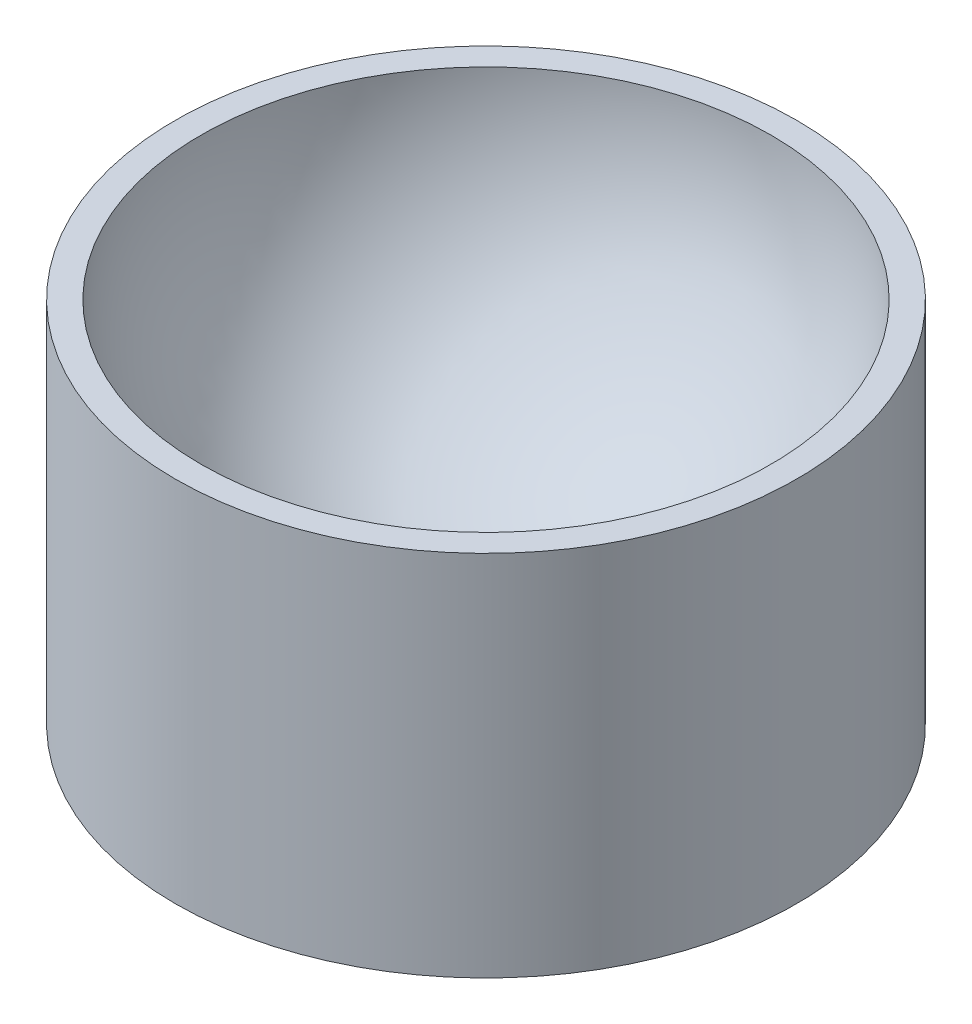
ISO-10303-21;
HEADER;
FILE_DESCRIPTION(('STEP AP214'),'2;1');
FILE_NAME('part.step','',(''),(''),'','','');
FILE_SCHEMA(('AUTOMOTIVE_DESIGN { 1 0 10303 214 1 1 1 1 }'));
ENDSEC;
DATA;
#1=APPLICATION_CONTEXT('core data for automotive mechanical design processes');
#2=APPLICATION_PROTOCOL_DEFINITION('international standard','automotive_design',2000,#1);
#3=PRODUCT_CONTEXT('',#1,'mechanical');
#4=PRODUCT('Part','Part','',(#3));
#5=PRODUCT_RELATED_PRODUCT_CATEGORY('part','',(#4));
#6=PRODUCT_DEFINITION_FORMATION('','',#4);
#7=PRODUCT_DEFINITION_CONTEXT('part definition',#1,'design');
#8=PRODUCT_DEFINITION('design','',#6,#7);
#9=PRODUCT_DEFINITION_SHAPE('','',#8);
#10=(LENGTH_UNIT() NAMED_UNIT(*) SI_UNIT(.MILLI.,.METRE.));
#11=(NAMED_UNIT(*) PLANE_ANGLE_UNIT() SI_UNIT($,.RADIAN.));
#12=(NAMED_UNIT(*) SI_UNIT($,.STERADIAN.) SOLID_ANGLE_UNIT());
#13=UNCERTAINTY_MEASURE_WITH_UNIT(LENGTH_MEASURE(1.E-05),#10,'distance_accuracy_value','');
#14=(GEOMETRIC_REPRESENTATION_CONTEXT(3) GLOBAL_UNCERTAINTY_ASSIGNED_CONTEXT((#13)) GLOBAL_UNIT_ASSIGNED_CONTEXT((#10,
#11,#12)) REPRESENTATION_CONTEXT('',''));
#15=CARTESIAN_POINT('',(0.,0.,0.));
#16=DIRECTION('',(0.,0.,1.));
#17=DIRECTION('',(1.,0.,0.));
#18=AXIS2_PLACEMENT_3D('',#15,#16,#17);
#19=CARTESIAN_POINT('',(6.5,11.5,-3.75277674973257));
#20=DIRECTION('',(-0.5,0.,0.866025403784439));
#21=DIRECTION('',(0.866025403784439,0.,0.5));
#22=AXIS2_PLACEMENT_3D('',#19,#20,#21);
#23=PLANE('',#22);
#24=DIRECTION('',(0.,-1.,0.));
#25=VECTOR('',#24,1.);
#26=CARTESIAN_POINT('',(0.,11.5,-7.50555349946514));
#27=LINE('',#26,#25);
#28=CARTESIAN_POINT('',(0.,11.5,-7.50555349946514));
#29=VERTEX_POINT('',#28);
#30=CARTESIAN_POINT('',(0.,7.,-7.50555349946514));
#31=VERTEX_POINT('',#30);
#32=EDGE_CURVE('E109',#29,#31,#27,.T.);
#33=ORIENTED_EDGE('',*,*,#32,.T.);
#34=DIRECTION('',(0.866025403784439,0.,0.5));
#35=VECTOR('',#34,1.);
#36=CARTESIAN_POINT('',(6.5,7.,-3.75277674973257));
#37=LINE('',#36,#35);
#38=CARTESIAN_POINT('',(6.5,7.,-3.75277674973257));
#39=VERTEX_POINT('',#38);
#40=EDGE_CURVE('E222',#31,#39,#37,.T.);
#41=ORIENTED_EDGE('',*,*,#40,.T.);
#42=DIRECTION('',(0.,-1.,0.));
#43=VECTOR('',#42,1.);
#44=CARTESIAN_POINT('',(6.5,11.5,-3.75277674973257));
#45=LINE('',#44,#43);
#46=CARTESIAN_POINT('',(6.5,11.5,-3.75277674973257));
#47=VERTEX_POINT('',#46);
#48=EDGE_CURVE('E238',#47,#39,#45,.T.);
#49=ORIENTED_EDGE('',*,*,#48,.F.);
#50=DIRECTION('',(-0.866025403784439,0.,-0.5));
#51=VECTOR('',#50,1.);
#52=CARTESIAN_POINT('',(6.5,11.5,-3.75277674973257));
#53=LINE('',#52,#51);
#54=EDGE_CURVE('E111',#47,#29,#53,.T.);
#55=ORIENTED_EDGE('',*,*,#54,.T.);
#56=EDGE_LOOP('',(#33,#41,#49,#55));
#57=FACE_BOUND('',#56,.T.);
#58=ADVANCED_FACE('F41',(#57),#23,.T.);
#59=CARTESIAN_POINT('',(0.,11.5,-7.50555349946514));
#60=DIRECTION('',(0.5,0.,0.866025403784439));
#61=DIRECTION('',(0.866025403784439,0.,-0.5));
#62=AXIS2_PLACEMENT_3D('',#59,#60,#61);
#63=PLANE('',#62);
#64=DIRECTION('',(0.,-1.,0.));
#65=VECTOR('',#64,1.);
#66=CARTESIAN_POINT('',(-6.5,11.5,-3.75277674973257));
#67=LINE('',#66,#65);
#68=CARTESIAN_POINT('',(-6.5,11.5,-3.75277674973257));
#69=VERTEX_POINT('',#68);
#70=CARTESIAN_POINT('',(-6.5,7.,-3.75277674973257));
#71=VERTEX_POINT('',#70);
#72=EDGE_CURVE('E107',#69,#71,#67,.T.);
#73=ORIENTED_EDGE('',*,*,#72,.T.);
#74=DIRECTION('',(0.866025403784439,0.,-0.5));
#75=VECTOR('',#74,1.);
#76=CARTESIAN_POINT('',(0.,7.,-7.50555349946514));
#77=LINE('',#76,#75);
#78=EDGE_CURVE('E219',#71,#31,#77,.T.);
#79=ORIENTED_EDGE('',*,*,#78,.T.);
#80=ORIENTED_EDGE('',*,*,#32,.F.);
#81=DIRECTION('',(-0.866025403784439,0.,0.5));
#82=VECTOR('',#81,1.);
#83=CARTESIAN_POINT('',(0.,11.5,-7.50555349946514));
#84=LINE('',#83,#82);
#85=EDGE_CURVE('E94',#29,#69,#84,.T.);
#86=ORIENTED_EDGE('',*,*,#85,.T.);
#87=EDGE_LOOP('',(#73,#79,#80,#86));
#88=FACE_BOUND('',#87,.T.);
#89=ADVANCED_FACE('F105',(#88),#63,.T.);
#90=CARTESIAN_POINT('',(-6.5,11.5,-3.75277674973257));
#91=DIRECTION('',(1.,0.,0.));
#92=DIRECTION('',(0.,0.,-1.));
#93=AXIS2_PLACEMENT_3D('',#90,#91,#92);
#94=PLANE('',#93);
#95=DIRECTION('',(0.,-1.,0.));
#96=VECTOR('',#95,1.);
#97=CARTESIAN_POINT('',(-6.5,11.5,3.75277674973257));
#98=LINE('',#97,#96);
#99=CARTESIAN_POINT('',(-6.5,11.5,3.75277674973257));
#100=VERTEX_POINT('',#99);
#101=CARTESIAN_POINT('',(-6.5,7.,3.75277674973257));
#102=VERTEX_POINT('',#101);
#103=EDGE_CURVE('E117',#100,#102,#98,.T.);
#104=ORIENTED_EDGE('',*,*,#103,.T.);
#105=DIRECTION('',(0.,0.,-1.));
#106=VECTOR('',#105,1.);
#107=CARTESIAN_POINT('',(-6.5,7.,-3.75277674973257));
#108=LINE('',#107,#106);
#109=EDGE_CURVE('E115',#102,#71,#108,.T.);
#110=ORIENTED_EDGE('',*,*,#109,.T.);
#111=ORIENTED_EDGE('',*,*,#72,.F.);
#112=DIRECTION('',(0.,0.,1.));
#113=VECTOR('',#112,1.);
#114=CARTESIAN_POINT('',(-6.5,11.5,-3.75277674973257));
#115=LINE('',#114,#113);
#116=EDGE_CURVE('E91',#69,#100,#115,.T.);
#117=ORIENTED_EDGE('',*,*,#116,.T.);
#118=EDGE_LOOP('',(#104,#110,#111,#117));
#119=FACE_BOUND('',#118,.T.);
#120=ADVANCED_FACE('F114',(#119),#94,.T.);
#121=CARTESIAN_POINT('',(-6.5,11.5,3.75277674973257));
#122=DIRECTION('',(0.5,0.,-0.866025403784439));
#123=DIRECTION('',(-0.866025403784439,0.,-0.5));
#124=AXIS2_PLACEMENT_3D('',#121,#122,#123);
#125=PLANE('',#124);
#126=DIRECTION('',(0.,-1.,0.));
#127=VECTOR('',#126,1.);
#128=CARTESIAN_POINT('',(0.,11.5,7.50555349946514));
#129=LINE('',#128,#127);
#130=CARTESIAN_POINT('',(0.,11.5,7.50555349946514));
#131=VERTEX_POINT('',#130);
#132=CARTESIAN_POINT('',(0.,7.,7.50555349946514));
#133=VERTEX_POINT('',#132);
#134=EDGE_CURVE('E122',#131,#133,#129,.T.);
#135=ORIENTED_EDGE('',*,*,#134,.T.);
#136=DIRECTION('',(-0.866025403784439,0.,-0.5));
#137=VECTOR('',#136,1.);
#138=CARTESIAN_POINT('',(-6.5,7.,3.75277674973257));
#139=LINE('',#138,#137);
#140=EDGE_CURVE('E213',#133,#102,#139,.T.);
#141=ORIENTED_EDGE('',*,*,#140,.T.);
#142=ORIENTED_EDGE('',*,*,#103,.F.);
#143=DIRECTION('',(0.866025403784439,0.,0.5));
#144=VECTOR('',#143,1.);
#145=CARTESIAN_POINT('',(-6.5,11.5,3.75277674973257));
#146=LINE('',#145,#144);
#147=EDGE_CURVE('E64',#100,#131,#146,.T.);
#148=ORIENTED_EDGE('',*,*,#147,.T.);
#149=EDGE_LOOP('',(#135,#141,#142,#148));
#150=FACE_BOUND('',#149,.T.);
#151=ADVANCED_FACE('F154',(#150),#125,.T.);
#152=CARTESIAN_POINT('',(0.,11.5,7.50555349946514));
#153=DIRECTION('',(-0.5,0.,-0.866025403784439));
#154=DIRECTION('',(-0.866025403784439,0.,0.5));
#155=AXIS2_PLACEMENT_3D('',#152,#153,#154);
#156=PLANE('',#155);
#157=DIRECTION('',(0.,-1.,0.));
#158=VECTOR('',#157,1.);
#159=CARTESIAN_POINT('',(6.5,11.5,3.75277674973257));
#160=LINE('',#159,#158);
#161=CARTESIAN_POINT('',(6.5,11.5,3.75277674973257));
#162=VERTEX_POINT('',#161);
#163=CARTESIAN_POINT('',(6.5,7.,3.75277674973257));
#164=VERTEX_POINT('',#163);
#165=EDGE_CURVE('E242',#162,#164,#160,.T.);
#166=ORIENTED_EDGE('',*,*,#165,.T.);
#167=DIRECTION('',(-0.866025403784439,0.,0.5));
#168=VECTOR('',#167,1.);
#169=CARTESIAN_POINT('',(0.,7.,7.50555349946514));
#170=LINE('',#169,#168);
#171=EDGE_CURVE('E57',#164,#133,#170,.T.);
#172=ORIENTED_EDGE('',*,*,#171,.T.);
#173=ORIENTED_EDGE('',*,*,#134,.F.);
#174=DIRECTION('',(0.866025403784439,0.,-0.5));
#175=VECTOR('',#174,1.);
#176=CARTESIAN_POINT('',(0.,11.5,7.50555349946514));
#177=LINE('',#176,#175);
#178=EDGE_CURVE('E230',#131,#162,#177,.T.);
#179=ORIENTED_EDGE('',*,*,#178,.T.);
#180=EDGE_LOOP('',(#166,#172,#173,#179));
#181=FACE_BOUND('',#180,.T.);
#182=ADVANCED_FACE('F140',(#181),#156,.T.);
#183=CARTESIAN_POINT('',(6.5,11.5,3.75277674973257));
#184=DIRECTION('',(-1.,0.,0.));
#185=DIRECTION('',(0.,0.,1.));
#186=AXIS2_PLACEMENT_3D('',#183,#184,#185);
#187=PLANE('',#186);
#188=ORIENTED_EDGE('',*,*,#48,.T.);
#189=DIRECTION('',(0.,0.,1.));
#190=VECTOR('',#189,1.);
#191=CARTESIAN_POINT('',(6.5,7.,3.75277674973257));
#192=LINE('',#191,#190);
#193=EDGE_CURVE('E11',#39,#164,#192,.T.);
#194=ORIENTED_EDGE('',*,*,#193,.T.);
#195=ORIENTED_EDGE('',*,*,#165,.F.);
#196=DIRECTION('',(0.,0.,-1.));
#197=VECTOR('',#196,1.);
#198=CARTESIAN_POINT('',(6.5,11.5,3.75277674973257));
#199=LINE('',#198,#197);
#200=EDGE_CURVE('E234',#162,#47,#199,.T.);
#201=ORIENTED_EDGE('',*,*,#200,.T.);
#202=EDGE_LOOP('',(#188,#194,#195,#201));
#203=FACE_BOUND('',#202,.T.);
#204=ADVANCED_FACE('F133',(#203),#187,.T.);
#205=CARTESIAN_POINT('',(0.,0.,0.));
#206=DIRECTION('',(0.,1.,0.));
#207=DIRECTION('',(0.,0.,1.));
#208=AXIS2_PLACEMENT_3D('',#205,#206,#207);
#209=PLANE('',#208);
#210=CARTESIAN_POINT('',(0.,0.,0.));
#211=DIRECTION('',(0.,-1.,0.));
#212=DIRECTION('',(0.,0.,-1.));
#213=AXIS2_PLACEMENT_3D('',#210,#211,#212);
#214=CIRCLE('',#213,8.);
#215=CARTESIAN_POINT('',(0.,0.,-8.));
#216=VERTEX_POINT('',#215);
#217=EDGE_CURVE('E203',#216,#216,#214,.T.);
#218=ORIENTED_EDGE('',*,*,#217,.F.);
#219=EDGE_LOOP('',(#218));
#220=FACE_BOUND('',#219,.T.);
#221=CARTESIAN_POINT('',(0.,0.,0.));
#222=DIRECTION('',(0.,1.,0.));
#223=DIRECTION('',(0.,0.,1.));
#224=AXIS2_PLACEMENT_3D('',#221,#222,#223);
#225=CIRCLE('',#224,54.5);
#226=CARTESIAN_POINT('',(0.,0.,54.5));
#227=VERTEX_POINT('',#226);
#228=EDGE_CURVE('E50',#227,#227,#225,.T.);
#229=ORIENTED_EDGE('',*,*,#228,.F.);
#230=EDGE_LOOP('',(#229));
#231=FACE_BOUND('',#230,.T.);
#232=ADVANCED_FACE('F131',(#220,#231),#209,.F.);
#233=CARTESIAN_POINT('',(0.,11.5,0.));
#234=DIRECTION('',(0.,-1.,0.));
#235=DIRECTION('',(0.,0.,-1.));
#236=AXIS2_PLACEMENT_3D('',#233,#234,#235);
#237=CYLINDRICAL_SURFACE('',#236,54.5);
#238=ORIENTED_EDGE('',*,*,#228,.T.);
#239=EDGE_LOOP('',(#238));
#240=FACE_BOUND('',#239,.T.);
#241=CARTESIAN_POINT('',(0.,64.5,0.));
#242=DIRECTION('',(0.,-1.,0.));
#243=DIRECTION('',(0.,0.,-1.));
#244=AXIS2_PLACEMENT_3D('',#241,#242,#243);
#245=CIRCLE('',#244,54.5);
#246=CARTESIAN_POINT('',(0.,64.5,-54.5));
#247=VERTEX_POINT('',#246);
#248=EDGE_CURVE('E189',#247,#247,#245,.T.);
#249=ORIENTED_EDGE('',*,*,#248,.T.);
#250=EDGE_LOOP('',(#249));
#251=FACE_BOUND('',#250,.T.);
#252=ADVANCED_FACE('F43',(#240,#251),#237,.T.);
#253=CARTESIAN_POINT('',(0.,7.,0.));
#254=DIRECTION('',(0.,-1.,0.));
#255=DIRECTION('',(0.,0.,-1.));
#256=AXIS2_PLACEMENT_3D('',#253,#254,#255);
#257=CYLINDRICAL_SURFACE('',#256,8.);
#258=CARTESIAN_POINT('',(0.,7.,0.));
#259=DIRECTION('',(0.,-1.,0.));
#260=DIRECTION('',(0.,0.,-1.));
#261=AXIS2_PLACEMENT_3D('',#258,#259,#260);
#262=CIRCLE('',#261,8.);
#263=CARTESIAN_POINT('',(0.,7.,-8.));
#264=VERTEX_POINT('',#263);
#265=EDGE_CURVE('E204',#264,#264,#262,.T.);
#266=ORIENTED_EDGE('',*,*,#265,.F.);
#267=EDGE_LOOP('',(#266));
#268=FACE_BOUND('',#267,.T.);
#269=ORIENTED_EDGE('',*,*,#217,.T.);
#270=EDGE_LOOP('',(#269));
#271=FACE_BOUND('',#270,.T.);
#272=ADVANCED_FACE('F139',(#268,#271),#257,.F.);
#273=CARTESIAN_POINT('',(0.,7.,0.));
#274=DIRECTION('',(0.,-1.,0.));
#275=DIRECTION('',(0.,0.,-1.));
#276=AXIS2_PLACEMENT_3D('',#273,#274,#275);
#277=PLANE('',#276);
#278=ORIENTED_EDGE('',*,*,#78,.F.);
#279=ORIENTED_EDGE('',*,*,#109,.F.);
#280=ORIENTED_EDGE('',*,*,#140,.F.);
#281=ORIENTED_EDGE('',*,*,#171,.F.);
#282=ORIENTED_EDGE('',*,*,#193,.F.);
#283=ORIENTED_EDGE('',*,*,#40,.F.);
#284=EDGE_LOOP('',(#278,#279,#280,#281,#282,#283));
#285=FACE_BOUND('',#284,.T.);
#286=ORIENTED_EDGE('',*,*,#265,.T.);
#287=EDGE_LOOP('',(#286));
#288=FACE_BOUND('',#287,.T.);
#289=ADVANCED_FACE('F163',(#285,#288),#277,.T.);
#290=CARTESIAN_POINT('',(4.05000000000001,11.5,0.));
#291=DIRECTION('',(0.,-1.,0.));
#292=DIRECTION('',(0.,0.,-1.));
#293=AXIS2_PLACEMENT_3D('',#290,#291,#292);
#294=PLANE('',#293);
#295=CARTESIAN_POINT('',(0.,11.5,0.));
#296=DIRECTION('',(0.,-1.,0.));
#297=DIRECTION('',(0.,0.,-1.));
#298=AXIS2_PLACEMENT_3D('',#295,#296,#297);
#299=CIRCLE('',#298,4.05000000000001);
#300=CARTESIAN_POINT('',(0.,11.5,-4.05000000000001));
#301=VERTEX_POINT('',#300);
#302=EDGE_CURVE('E191',#301,#301,#299,.T.);
#303=ORIENTED_EDGE('',*,*,#302,.F.);
#304=EDGE_LOOP('',(#303));
#305=FACE_BOUND('',#304,.T.);
#306=ORIENTED_EDGE('',*,*,#85,.F.);
#307=ORIENTED_EDGE('',*,*,#54,.F.);
#308=ORIENTED_EDGE('',*,*,#200,.F.);
#309=ORIENTED_EDGE('',*,*,#178,.F.);
#310=ORIENTED_EDGE('',*,*,#147,.F.);
#311=ORIENTED_EDGE('',*,*,#116,.F.);
#312=EDGE_LOOP('',(#306,#307,#308,#309,#310,#311));
#313=FACE_BOUND('',#312,.T.);
#314=ADVANCED_FACE('F93',(#305,#313),#294,.T.);
#315=CARTESIAN_POINT('',(0.,64.5,0.));
#316=DIRECTION('',(0.,-1.,0.));
#317=DIRECTION('',(1.,0.,0.));
#318=AXIS2_PLACEMENT_3D('',#315,#316,#317);
#319=SPHERICAL_SURFACE('',#318,50.);
#320=CARTESIAN_POINT('',(0.,14.6642949282344,0.));
#321=DIRECTION('',(0.,-1.,0.));
#322=DIRECTION('',(0.,0.,-1.));
#323=AXIS2_PLACEMENT_3D('',#320,#321,#322);
#324=CIRCLE('',#323,4.05);
#325=CARTESIAN_POINT('',(0.,14.6642949282344,-4.05));
#326=VERTEX_POINT('',#325);
#327=EDGE_CURVE('E196',#326,#326,#324,.T.);
#328=ORIENTED_EDGE('',*,*,#327,.T.);
#329=EDGE_LOOP('',(#328));
#330=FACE_BOUND('',#329,.T.);
#331=CARTESIAN_POINT('',(0.,64.5,0.));
#332=DIRECTION('',(0.,-1.,0.));
#333=DIRECTION('',(0.,0.,-1.));
#334=AXIS2_PLACEMENT_3D('',#331,#332,#333);
#335=CIRCLE('',#334,50.);
#336=CARTESIAN_POINT('',(0.,64.5,-50.));
#337=VERTEX_POINT('',#336);
#338=EDGE_CURVE('E186',#337,#337,#335,.T.);
#339=ORIENTED_EDGE('',*,*,#338,.F.);
#340=EDGE_LOOP('',(#339));
#341=FACE_BOUND('',#340,.T.);
#342=ADVANCED_FACE('F167',(#330,#341),#319,.F.);
#343=CARTESIAN_POINT('',(0.,0.,0.));
#344=DIRECTION('',(0.,-1.,0.));
#345=DIRECTION('',(0.,0.,-1.));
#346=AXIS2_PLACEMENT_3D('',#343,#344,#345);
#347=CYLINDRICAL_SURFACE('',#346,4.05);
#348=ORIENTED_EDGE('',*,*,#302,.T.);
#349=EDGE_LOOP('',(#348));
#350=FACE_BOUND('',#349,.T.);
#351=ORIENTED_EDGE('',*,*,#327,.F.);
#352=EDGE_LOOP('',(#351));
#353=FACE_BOUND('',#352,.T.);
#354=ADVANCED_FACE('F170',(#350,#353),#347,.F.);
#355=CARTESIAN_POINT('',(54.5,64.5,0.));
#356=DIRECTION('',(0.,1.,0.));
#357=DIRECTION('',(0.,0.,1.));
#358=AXIS2_PLACEMENT_3D('',#355,#356,#357);
#359=PLANE('',#358);
#360=ORIENTED_EDGE('',*,*,#338,.T.);
#361=EDGE_LOOP('',(#360));
#362=FACE_BOUND('',#361,.T.);
#363=ORIENTED_EDGE('',*,*,#248,.F.);
#364=EDGE_LOOP('',(#363));
#365=FACE_BOUND('',#364,.T.);
#366=ADVANCED_FACE('F174',(#362,#365),#359,.T.);
#367=CLOSED_SHELL('',(#58,#89,#120,#151,#182,#204,#232,#252,#272,#289,#314,#342,#354,#366));
#368=MANIFOLD_SOLID_BREP('B2',#367);
#369=ADVANCED_BREP_SHAPE_REPRESENTATION('',(#18,#368),#14);
#370=SHAPE_DEFINITION_REPRESENTATION(#9,#369);
ENDSEC;
END-ISO-10303-21;
